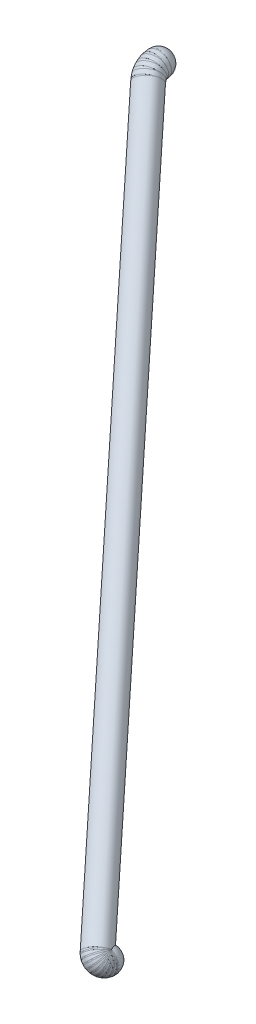
ISO-10303-21;
HEADER;
FILE_DESCRIPTION(('STEP AP214'),'2;1');
FILE_NAME('part.step','',(''),(''),'','','');
FILE_SCHEMA(('AUTOMOTIVE_DESIGN { 1 0 10303 214 1 1 1 1 }'));
ENDSEC;
DATA;
#1=APPLICATION_CONTEXT('core data for automotive mechanical design processes');
#2=APPLICATION_PROTOCOL_DEFINITION('international standard','automotive_design',2000,#1);
#3=PRODUCT_CONTEXT('',#1,'mechanical');
#4=PRODUCT('Part','Part','',(#3));
#5=PRODUCT_RELATED_PRODUCT_CATEGORY('part','',(#4));
#6=PRODUCT_DEFINITION_FORMATION('','',#4);
#7=PRODUCT_DEFINITION_CONTEXT('part definition',#1,'design');
#8=PRODUCT_DEFINITION('design','',#6,#7);
#9=PRODUCT_DEFINITION_SHAPE('','',#8);
#10=(LENGTH_UNIT() NAMED_UNIT(*) SI_UNIT(.MILLI.,.METRE.));
#11=(NAMED_UNIT(*) PLANE_ANGLE_UNIT() SI_UNIT($,.RADIAN.));
#12=(NAMED_UNIT(*) SI_UNIT($,.STERADIAN.) SOLID_ANGLE_UNIT());
#13=UNCERTAINTY_MEASURE_WITH_UNIT(LENGTH_MEASURE(1.E-05),#10,'distance_accuracy_value','');
#14=(GEOMETRIC_REPRESENTATION_CONTEXT(3) GLOBAL_UNCERTAINTY_ASSIGNED_CONTEXT((#13)) GLOBAL_UNIT_ASSIGNED_CONTEXT((#10,
#11,#12)) REPRESENTATION_CONTEXT('',''));
#15=CARTESIAN_POINT('',(0.,0.,0.));
#16=DIRECTION('',(0.,0.,1.));
#17=DIRECTION('',(1.,0.,0.));
#18=AXIS2_PLACEMENT_3D('',#15,#16,#17);
#19=CARTESIAN_POINT('',(-60.,-163.5,298.5));
#20=DIRECTION('',(0.,0.,1.));
#21=DIRECTION('',(1.,0.,0.));
#22=AXIS2_PLACEMENT_3D('',#19,#20,#21);
#23=PLANE('',#22);
#24=CARTESIAN_POINT('',(-60.,-163.5,298.5));
#25=DIRECTION('',(0.,0.,1.));
#26=DIRECTION('',(1.,0.,0.));
#27=AXIS2_PLACEMENT_3D('',#24,#25,#26);
#28=CIRCLE('',#27,1.9);
#29=CARTESIAN_POINT('',(-58.1,-163.5,298.5));
#30=VERTEX_POINT('',#29);
#31=EDGE_CURVE('P0_E11',#30,#30,#28,.T.);
#32=ORIENTED_EDGE('',*,*,#31,.F.);
#33=EDGE_LOOP('',(#32));
#34=FACE_BOUND('',#33,.T.);
#35=ADVANCED_FACE('P0_F16',(#34),#23,.F.);
#36=CARTESIAN_POINT('',(-60.,-163.5,298.53));
#37=DIRECTION('',(0.,0.,1.));
#38=DIRECTION('',(1.,0.,0.));
#39=AXIS2_PLACEMENT_3D('',#36,#37,#38);
#40=PLANE('',#39);
#41=CARTESIAN_POINT('',(-60.,-163.5,298.53));
#42=DIRECTION('',(0.,0.,1.));
#43=DIRECTION('',(1.,0.,0.));
#44=AXIS2_PLACEMENT_3D('',#41,#42,#43);
#45=CIRCLE('',#44,1.9);
#46=CARTESIAN_POINT('',(-58.1,-163.5,298.53));
#47=VERTEX_POINT('',#46);
#48=EDGE_CURVE('P0_E41',#47,#47,#45,.T.);
#49=ORIENTED_EDGE('',*,*,#48,.T.);
#50=EDGE_LOOP('',(#49));
#51=FACE_BOUND('',#50,.T.);
#52=ADVANCED_FACE('P0_F18',(#51),#40,.T.);
#53=CARTESIAN_POINT('',(-60.,-163.5,298.5));
#54=DIRECTION('',(0.,0.,1.));
#55=DIRECTION('',(1.,0.,0.));
#56=AXIS2_PLACEMENT_3D('',#53,#54,#55);
#57=CYLINDRICAL_SURFACE('',#56,1.9);
#58=ORIENTED_EDGE('',*,*,#48,.F.);
#59=DIRECTION('',(0.,0.,1.));
#60=VECTOR('',#59,1.);
#61=CARTESIAN_POINT('',(-58.1,-163.5,298.5));
#62=LINE('',#61,#60);
#63=EDGE_CURVE('P0_E26',#30,#47,#62,.T.);
#64=ORIENTED_EDGE('',*,*,#63,.F.);
#65=ORIENTED_EDGE('',*,*,#31,.T.);
#66=ORIENTED_EDGE('',*,*,#63,.T.);
#67=EDGE_LOOP('',(#58,#64,#65,#66));
#68=FACE_BOUND('',#67,.T.);
#69=ADVANCED_FACE('P0_F40',(#68),#57,.T.);
#70=CLOSED_SHELL('',(#35,#52,#69));
#71=MANIFOLD_SOLID_BREP('P0_B1',#70);
#72=CARTESIAN_POINT('',(-60.,-163.5,298.53));
#73=DIRECTION('',(-0.0867359547423549,0.0890184798671858,0.992246231737399));
#74=DIRECTION('',(0.71622958814504,0.6978647269103,0.));
#75=AXIS2_PLACEMENT_3D('',#72,#73,#74);
#76=PLANE('',#75);
#77=CARTESIAN_POINT('',(-60.,-163.5,298.53));
#78=DIRECTION('',(-0.0867359547423549,0.0890184798671977,0.992246231737398));
#79=DIRECTION('',(0.,0.995999820742464,-0.0893552297349117));
#80=AXIS2_PLACEMENT_3D('',#77,#78,#79);
#81=CIRCLE('',#80,1.9);
#82=CARTESIAN_POINT('',(-60.,-161.6076003405,298.3602250635));
#83=VERTEX_POINT('',#82);
#84=EDGE_CURVE('P1_E11',#83,#83,#81,.T.);
#85=ORIENTED_EDGE('',*,*,#84,.F.);
#86=EDGE_LOOP('',(#85));
#87=FACE_BOUND('',#86,.T.);
#88=ADVANCED_FACE('P1_F16',(#87),#76,.F.);
#89=CARTESIAN_POINT('',(-60.01528279548,-163.4843150256,298.70483287377));
#90=DIRECTION('',(-0.0867359547423549,0.0890184798671858,0.992246231737399));
#91=DIRECTION('',(0.71622958814504,0.6978647269103,0.));
#92=AXIS2_PLACEMENT_3D('',#89,#90,#91);
#93=PLANE('',#92);
#94=CARTESIAN_POINT('',(-60.01528279548,-163.4843150256,298.70483287377));
#95=DIRECTION('',(-0.0867359547423549,0.0890184798671977,0.992246231737398));
#96=DIRECTION('',(0.,0.995999820742464,-0.0893552297349117));
#97=AXIS2_PLACEMENT_3D('',#94,#95,#96);
#98=CIRCLE('',#97,1.9);
#99=CARTESIAN_POINT('',(-60.01528279548,-161.5919153662,298.53505793728));
#100=VERTEX_POINT('',#99);
#101=EDGE_CURVE('P1_E41',#100,#100,#98,.T.);
#102=ORIENTED_EDGE('',*,*,#101,.T.);
#103=EDGE_LOOP('',(#102));
#104=FACE_BOUND('',#103,.T.);
#105=ADVANCED_FACE('P1_F18',(#104),#93,.T.);
#106=CARTESIAN_POINT('',(-60.,-163.5,298.53));
#107=DIRECTION('',(-0.0867359547423549,0.0890184798671977,0.992246231737398));
#108=DIRECTION('',(0.,0.995999820742464,-0.0893552297349117));
#109=AXIS2_PLACEMENT_3D('',#106,#107,#108);
#110=CYLINDRICAL_SURFACE('',#109,1.9);
#111=ORIENTED_EDGE('',*,*,#101,.F.);
#112=DIRECTION('',(-0.0867359547423549,0.0890184798671858,0.992246231737399));
#113=VECTOR('',#112,1.);
#114=CARTESIAN_POINT('',(-60.,-161.6076003405,298.3602250635));
#115=LINE('',#114,#113);
#116=EDGE_CURVE('P1_E20',#83,#100,#115,.T.);
#117=ORIENTED_EDGE('',*,*,#116,.F.);
#118=ORIENTED_EDGE('',*,*,#84,.T.);
#119=ORIENTED_EDGE('',*,*,#116,.T.);
#120=EDGE_LOOP('',(#111,#117,#118,#119));
#121=FACE_BOUND('',#120,.T.);
#122=ADVANCED_FACE('P1_F40',(#121),#110,.T.);
#123=CLOSED_SHELL('',(#88,#105,#122));
#124=MANIFOLD_SOLID_BREP('P1_B1',#123);
#125=CARTESIAN_POINT('',(-60.01528279548,-163.4843150256,298.70483287377));
#126=DIRECTION('',(-0.254848478864056,0.261555017782057,0.930935672049205));
#127=DIRECTION('',(0.716229588145616,0.697864726909709,0.));
#128=AXIS2_PLACEMENT_3D('',#125,#126,#127);
#129=PLANE('',#128);
#130=CARTESIAN_POINT('',(-60.01528279548,-163.4843150256,298.70483287377));
#131=DIRECTION('',(-0.254848478864056,0.2615550177822,0.930935672049165));
#132=DIRECTION('',(0.,0.962723851674372,-0.270486201898104));
#133=AXIS2_PLACEMENT_3D('',#130,#131,#132);
#134=CIRCLE('',#133,1.9);
#135=CARTESIAN_POINT('',(-60.01528279548,-161.6551397075,298.19090909017));
#136=VERTEX_POINT('',#135);
#137=EDGE_CURVE('P2_E11',#136,#136,#134,.T.);
#138=ORIENTED_EDGE('',*,*,#137,.F.);
#139=EDGE_LOOP('',(#138));
#140=FACE_BOUND('',#139,.T.);
#141=ADVANCED_FACE('P2_F16',(#140),#129,.F.);
#142=CARTESIAN_POINT('',(-60.06018686315,-163.438229272,298.8688628833));
#143=DIRECTION('',(-0.254848478864056,0.261555017782057,0.930935672049205));
#144=DIRECTION('',(0.716229588145616,0.697864726909709,0.));
#145=AXIS2_PLACEMENT_3D('',#142,#143,#144);
#146=PLANE('',#145);
#147=CARTESIAN_POINT('',(-60.06018686315,-163.438229272,298.8688628833));
#148=DIRECTION('',(-0.254848478864056,0.2615550177822,0.930935672049165));
#149=DIRECTION('',(0.,0.962723851674372,-0.270486201898104));
#150=AXIS2_PLACEMENT_3D('',#147,#148,#149);
#151=CIRCLE('',#150,1.9);
#152=CARTESIAN_POINT('',(-60.06018686315,-161.6090539538,298.3549390997));
#153=VERTEX_POINT('',#152);
#154=EDGE_CURVE('P2_E40',#153,#153,#151,.T.);
#155=ORIENTED_EDGE('',*,*,#154,.T.);
#156=EDGE_LOOP('',(#155));
#157=FACE_BOUND('',#156,.T.);
#158=ADVANCED_FACE('P2_F43',(#157),#146,.T.);
#159=CARTESIAN_POINT('',(-60.01528279548,-163.4843150256,298.70483287377));
#160=DIRECTION('',(-0.254848478864056,0.2615550177822,0.930935672049165));
#161=DIRECTION('',(0.,0.962723851674372,-0.270486201898104));
#162=AXIS2_PLACEMENT_3D('',#159,#160,#161);
#163=CYLINDRICAL_SURFACE('',#162,1.9);
#164=ORIENTED_EDGE('',*,*,#154,.F.);
#165=DIRECTION('',(-0.254848478864056,0.261555017782057,0.930935672049205));
#166=VECTOR('',#165,1.);
#167=CARTESIAN_POINT('',(-60.01528279548,-161.6551397075,298.19090909017));
#168=LINE('',#167,#166);
#169=EDGE_CURVE('P2_E20',#136,#153,#168,.T.);
#170=ORIENTED_EDGE('',*,*,#169,.F.);
#171=ORIENTED_EDGE('',*,*,#137,.T.);
#172=ORIENTED_EDGE('',*,*,#169,.T.);
#173=EDGE_LOOP('',(#164,#170,#171,#172));
#174=FACE_BOUND('',#173,.T.);
#175=ADVANCED_FACE('P2_F18',(#174),#163,.T.);
#176=CLOSED_SHELL('',(#141,#158,#175));
#177=MANIFOLD_SOLID_BREP('P2_B1',#176);
#178=CARTESIAN_POINT('',(-60.06018686315,-163.438229272,298.8688628833));
#179=DIRECTION('',(-0.407214001511057,0.417930159446059,0.812102911458114));
#180=DIRECTION('',(0.716229588145331,0.697864726910001,0.));
#181=AXIS2_PLACEMENT_3D('',#178,#179,#180);
#182=PLANE('',#181);
#183=CARTESIAN_POINT('',(-60.06018686315,-163.438229272,298.8688628833));
#184=DIRECTION('',(-0.407214001511057,0.417930159446104,0.81210291145809));
#185=DIRECTION('',(0.,0.889164315716029,-0.457588045798015));
#186=AXIS2_PLACEMENT_3D('',#183,#184,#185);
#187=CIRCLE('',#186,1.9);
#188=CARTESIAN_POINT('',(-60.06018686315,-161.7488170721,297.99944559629));
#189=VERTEX_POINT('',#188);
#190=EDGE_CURVE('P3_E11',#189,#189,#187,.T.);
#191=ORIENTED_EDGE('',*,*,#190,.F.);
#192=EDGE_LOOP('',(#191));
#193=FACE_BOUND('',#192,.T.);
#194=ADVANCED_FACE('P3_F16',(#193),#182,.F.);
#195=CARTESIAN_POINT('',(-60.13193759583,-163.3645903621,299.01195466967));
#196=DIRECTION('',(-0.407214001511057,0.417930159446059,0.812102911458114));
#197=DIRECTION('',(0.716229588145331,0.697864726910001,0.));
#198=AXIS2_PLACEMENT_3D('',#195,#196,#197);
#199=PLANE('',#198);
#200=CARTESIAN_POINT('',(-60.13193759583,-163.3645903621,299.01195466967));
#201=DIRECTION('',(-0.407214001511057,0.417930159446104,0.81210291145809));
#202=DIRECTION('',(0.,0.889164315716029,-0.457588045798015));
#203=AXIS2_PLACEMENT_3D('',#200,#201,#202);
#204=CIRCLE('',#203,1.9);
#205=CARTESIAN_POINT('',(-60.13193759583,-161.6751781623,298.14253738265));
#206=VERTEX_POINT('',#205);
#207=EDGE_CURVE('P3_E40',#206,#206,#204,.T.);
#208=ORIENTED_EDGE('',*,*,#207,.T.);
#209=EDGE_LOOP('',(#208));
#210=FACE_BOUND('',#209,.T.);
#211=ADVANCED_FACE('P3_F44',(#210),#199,.T.);
#212=CARTESIAN_POINT('',(-60.06018686315,-163.438229272,298.8688628833));
#213=DIRECTION('',(-0.407214001511057,0.417930159446104,0.81210291145809));
#214=DIRECTION('',(0.,0.889164315716029,-0.457588045798015));
#215=AXIS2_PLACEMENT_3D('',#212,#213,#214);
#216=CYLINDRICAL_SURFACE('',#215,1.9);
#217=ORIENTED_EDGE('',*,*,#207,.F.);
#218=DIRECTION('',(-0.407214001511057,0.417930159446059,0.812102911458114));
#219=VECTOR('',#218,1.);
#220=CARTESIAN_POINT('',(-60.06018686315,-161.7488170721,297.99944559629));
#221=LINE('',#220,#219);
#222=EDGE_CURVE('P3_E24',#189,#206,#221,.T.);
#223=ORIENTED_EDGE('',*,*,#222,.F.);
#224=ORIENTED_EDGE('',*,*,#190,.T.);
#225=ORIENTED_EDGE('',*,*,#222,.T.);
#226=EDGE_LOOP('',(#217,#223,#224,#225));
#227=FACE_BOUND('',#226,.T.);
#228=ADVANCED_FACE('P3_F39',(#227),#216,.T.);
#229=CLOSED_SHELL('',(#194,#211,#228));
#230=MANIFOLD_SOLID_BREP('P3_B1',#229);
#231=CARTESIAN_POINT('',(-60.13193759583,-163.3645903621,299.01195466967));
#232=DIRECTION('',(-0.534417908476082,0.548481537646084,0.643090586124099));
#233=DIRECTION('',(0.716229588144646,0.697864726910704,0.));
#234=AXIS2_PLACEMENT_3D('',#231,#232,#233);
#235=PLANE('',#234);
#236=CARTESIAN_POINT('',(-60.13193759583,-163.3645903621,299.01195466967));
#237=DIRECTION('',(-0.534417908476082,0.548481537645893,0.643090586124262));
#238=DIRECTION('',(0.,0.760855508919188,-0.648921331555161));
#239=AXIS2_PLACEMENT_3D('',#236,#237,#238);
#240=CIRCLE('',#239,1.9);
#241=CARTESIAN_POINT('',(-60.13193759583,-161.9189648952,297.77900413971));
#242=VERTEX_POINT('',#241);
#243=EDGE_CURVE('P4_E11',#242,#242,#240,.T.);
#244=ORIENTED_EDGE('',*,*,#243,.F.);
#245=EDGE_LOOP('',(#244));
#246=FACE_BOUND('',#245,.T.);
#247=ADVANCED_FACE('P4_F16',(#246),#235,.F.);
#248=CARTESIAN_POINT('',(-60.22610153997,-163.2679484195,299.12526663969));
#249=DIRECTION('',(-0.534417908476082,0.548481537646084,0.643090586124099));
#250=DIRECTION('',(0.716229588144646,0.697864726910704,0.));
#251=AXIS2_PLACEMENT_3D('',#248,#249,#250);
#252=PLANE('',#251);
#253=CARTESIAN_POINT('',(-60.22610153997,-163.2679484195,299.12526663969));
#254=DIRECTION('',(-0.534417908476082,0.548481537645893,0.643090586124262));
#255=DIRECTION('',(0.,0.760855508919188,-0.648921331555161));
#256=AXIS2_PLACEMENT_3D('',#253,#254,#255);
#257=CIRCLE('',#256,1.9);
#258=CARTESIAN_POINT('',(-60.22610153997,-161.8223229525,297.89231610974));
#259=VERTEX_POINT('',#258);
#260=EDGE_CURVE('P4_E40',#259,#259,#257,.T.);
#261=ORIENTED_EDGE('',*,*,#260,.T.);
#262=EDGE_LOOP('',(#261));
#263=FACE_BOUND('',#262,.T.);
#264=ADVANCED_FACE('P4_F43',(#263),#252,.T.);
#265=CARTESIAN_POINT('',(-60.13193759583,-163.3645903621,299.01195466967));
#266=DIRECTION('',(-0.534417908476082,0.548481537645893,0.643090586124262));
#267=DIRECTION('',(0.,0.760855508919188,-0.648921331555161));
#268=AXIS2_PLACEMENT_3D('',#265,#266,#267);
#269=CYLINDRICAL_SURFACE('',#268,1.9);
#270=ORIENTED_EDGE('',*,*,#260,.F.);
#271=DIRECTION('',(-0.534417908476082,0.548481537646084,0.643090586124099));
#272=VECTOR('',#271,1.);
#273=CARTESIAN_POINT('',(-60.13193759583,-161.9189648952,297.77900413971));
#274=LINE('',#273,#272);
#275=EDGE_CURVE('P4_E19',#242,#259,#274,.T.);
#276=ORIENTED_EDGE('',*,*,#275,.F.);
#277=ORIENTED_EDGE('',*,*,#243,.T.);
#278=ORIENTED_EDGE('',*,*,#275,.T.);
#279=EDGE_LOOP('',(#270,#276,#277,#278));
#280=FACE_BOUND('',#279,.T.);
#281=ADVANCED_FACE('P4_F39',(#280),#269,.T.);
#282=CLOSED_SHELL('',(#247,#264,#281));
#283=MANIFOLD_SOLID_BREP('P4_B1',#282);
#284=CARTESIAN_POINT('',(-60.22610153997,-163.2679484195,299.12526663969));
#285=DIRECTION('',(-0.628600313288895,0.645142426795892,0.434341910573928));
#286=DIRECTION('',(0.568463974274732,0.,0.822708156001736));
#287=AXIS2_PLACEMENT_3D('',#284,#285,#286);
#288=PLANE('',#287);
#289=CARTESIAN_POINT('',(-60.22610153997,-163.2679484195,299.12526663969));
#290=DIRECTION('',(-0.628600313288356,0.645142426796418,0.434341910573928));
#291=DIRECTION('',(0.71622958814517,0.697864726910166,0.));
#292=AXIS2_PLACEMENT_3D('',#289,#290,#291);
#293=CIRCLE('',#292,1.9);
#294=CARTESIAN_POINT('',(-58.86526532249,-161.9420054383,299.12526663969));
#295=VERTEX_POINT('',#294);
#296=EDGE_CURVE('P5_E11',#295,#295,#293,.T.);
#297=ORIENTED_EDGE('',*,*,#296,.F.);
#298=EDGE_LOOP('',(#297));
#299=FACE_BOUND('',#298,.T.);
#300=ADVANCED_FACE('P5_F16',(#299),#288,.F.);
#301=CARTESIAN_POINT('',(-60.33686033725,-163.154274917,299.20179728501));
#302=DIRECTION('',(-0.628600313288895,0.645142426795892,0.434341910573928));
#303=DIRECTION('',(0.568463974274732,0.,0.822708156001736));
#304=AXIS2_PLACEMENT_3D('',#301,#302,#303);
#305=PLANE('',#304);
#306=CARTESIAN_POINT('',(-60.33686033725,-163.154274917,299.20179728501));
#307=DIRECTION('',(-0.628600313288356,0.645142426796418,0.434341910573928));
#308=DIRECTION('',(0.71622958814517,0.697864726910166,0.));
#309=AXIS2_PLACEMENT_3D('',#306,#307,#308);
#310=CIRCLE('',#309,1.9);
#311=CARTESIAN_POINT('',(-58.97602411977,-161.8283319359,299.20179728501));
#312=VERTEX_POINT('',#311);
#313=EDGE_CURVE('P5_E40',#312,#312,#310,.T.);
#314=ORIENTED_EDGE('',*,*,#313,.T.);
#315=EDGE_LOOP('',(#314));
#316=FACE_BOUND('',#315,.T.);
#317=ADVANCED_FACE('P5_F44',(#316),#305,.T.);
#318=CARTESIAN_POINT('',(-60.22610153997,-163.2679484195,299.12526663969));
#319=DIRECTION('',(-0.628600313288356,0.645142426796418,0.434341910573928));
#320=DIRECTION('',(0.71622958814517,0.697864726910166,0.));
#321=AXIS2_PLACEMENT_3D('',#318,#319,#320);
#322=CYLINDRICAL_SURFACE('',#321,1.9);
#323=ORIENTED_EDGE('',*,*,#313,.F.);
#324=DIRECTION('',(-0.628600313288895,0.645142426795892,0.434341910573928));
#325=VECTOR('',#324,1.);
#326=CARTESIAN_POINT('',(-58.86526532249,-161.9420054383,299.12526663969));
#327=LINE('',#326,#325);
#328=EDGE_CURVE('P5_E24',#295,#312,#327,.T.);
#329=ORIENTED_EDGE('',*,*,#328,.F.);
#330=ORIENTED_EDGE('',*,*,#296,.T.);
#331=ORIENTED_EDGE('',*,*,#328,.T.);
#332=EDGE_LOOP('',(#323,#329,#330,#331));
#333=FACE_BOUND('',#332,.T.);
#334=ADVANCED_FACE('P5_F39',(#333),#322,.T.);
#335=CLOSED_SHELL('',(#300,#317,#334));
#336=MANIFOLD_SOLID_BREP('P5_B1',#335);
#337=CARTESIAN_POINT('',(-60.33686033725,-163.154274917,299.20179728501));
#338=DIRECTION('',(-0.683941716951242,0.701940183187249,0.19875539499807));
#339=DIRECTION('',(0.27905837744282,0.,0.960274138972294));
#340=AXIS2_PLACEMENT_3D('',#337,#338,#339);
#341=PLANE('',#340);
#342=CARTESIAN_POINT('',(-60.33686033725,-163.154274917,299.20179728501));
#343=DIRECTION('',(-0.683941716951208,0.701940183187282,0.19875539499807));
#344=DIRECTION('',(0.71622958814517,0.697864726910166,0.));
#345=AXIS2_PLACEMENT_3D('',#342,#343,#344);
#346=CIRCLE('',#345,1.9);
#347=CARTESIAN_POINT('',(-58.97602411977,-161.8283319359,299.20179728501));
#348=VERTEX_POINT('',#347);
#349=EDGE_CURVE('P6_E11',#348,#348,#346,.T.);
#350=ORIENTED_EDGE('',*,*,#349,.F.);
#351=EDGE_LOOP('',(#350));
#352=FACE_BOUND('',#351,.T.);
#353=ADVANCED_FACE('P6_F16',(#352),#341,.F.);
#354=CARTESIAN_POINT('',(-60.45737023897,-163.0305937021,299.23681780288));
#355=DIRECTION('',(-0.683941716951242,0.701940183187249,0.19875539499807));
#356=DIRECTION('',(0.27905837744282,0.,0.960274138972294));
#357=AXIS2_PLACEMENT_3D('',#354,#355,#356);
#358=PLANE('',#357);
#359=CARTESIAN_POINT('',(-60.45737023897,-163.0305937021,299.23681780288));
#360=DIRECTION('',(-0.683941716951208,0.701940183187282,0.19875539499807));
#361=DIRECTION('',(0.71622958814517,0.697864726910166,0.));
#362=AXIS2_PLACEMENT_3D('',#359,#360,#361);
#363=CIRCLE('',#362,1.9);
#364=CARTESIAN_POINT('',(-59.09653402149,-161.7046507209,299.23681780288));
#365=VERTEX_POINT('',#364);
#366=EDGE_CURVE('P6_E40',#365,#365,#363,.T.);
#367=ORIENTED_EDGE('',*,*,#366,.T.);
#368=EDGE_LOOP('',(#367));
#369=FACE_BOUND('',#368,.T.);
#370=ADVANCED_FACE('P6_F43',(#369),#358,.T.);
#371=CARTESIAN_POINT('',(-60.33686033725,-163.154274917,299.20179728501));
#372=DIRECTION('',(-0.683941716951208,0.701940183187282,0.19875539499807));
#373=DIRECTION('',(0.71622958814517,0.697864726910166,0.));
#374=AXIS2_PLACEMENT_3D('',#371,#372,#373);
#375=CYLINDRICAL_SURFACE('',#374,1.9);
#376=ORIENTED_EDGE('',*,*,#366,.F.);
#377=DIRECTION('',(-0.683941716951242,0.701940183187249,0.19875539499807));
#378=VECTOR('',#377,1.);
#379=CARTESIAN_POINT('',(-58.97602411977,-161.8283319359,299.20179728501));
#380=LINE('',#379,#378);
#381=EDGE_CURVE('P6_E20',#348,#365,#380,.T.);
#382=ORIENTED_EDGE('',*,*,#381,.F.);
#383=ORIENTED_EDGE('',*,*,#349,.T.);
#384=ORIENTED_EDGE('',*,*,#381,.T.);
#385=EDGE_LOOP('',(#376,#382,#383,#384));
#386=FACE_BOUND('',#385,.T.);
#387=ADVANCED_FACE('P6_F18',(#386),#375,.T.);
#388=CLOSED_SHELL('',(#353,#370,#387));
#389=MANIFOLD_SOLID_BREP('P6_B1',#388);
#390=CARTESIAN_POINT('',(-60.45737023897,-163.0305937021,299.23681780288));
#391=DIRECTION('',(-0.697022592814664,0.715365292625655,-0.0491121493373463));
#392=DIRECTION('',(-0.0702856562176884,0.,0.997526905165995));
#393=AXIS2_PLACEMENT_3D('',#390,#391,#392);
#394=PLANE('',#393);
#395=CARTESIAN_POINT('',(-60.45737023897,-163.0305937021,299.23681780288));
#396=DIRECTION('',(-0.697022592814441,0.715365292625873,-0.0491121493373463));
#397=DIRECTION('',(0.71622958814517,0.697864726910166,0.));
#398=AXIS2_PLACEMENT_3D('',#395,#396,#397);
#399=CIRCLE('',#398,1.9);
#400=CARTESIAN_POINT('',(-59.09653402149,-161.7046507209,299.23681780288));
#401=VERTEX_POINT('',#400);
#402=EDGE_CURVE('P7_E11',#401,#401,#399,.T.);
#403=ORIENTED_EDGE('',*,*,#402,.F.);
#404=EDGE_LOOP('',(#403));
#405=FACE_BOUND('',#404,.T.);
#406=ADVANCED_FACE('P7_F16',(#405),#394,.F.);
#407=CARTESIAN_POINT('',(-60.58018497899,-162.9045469952,299.22816428732));
#408=DIRECTION('',(-0.697022592814664,0.715365292625655,-0.0491121493373463));
#409=DIRECTION('',(-0.0702856562176884,0.,0.997526905165995));
#410=AXIS2_PLACEMENT_3D('',#407,#408,#409);
#411=PLANE('',#410);
#412=CARTESIAN_POINT('',(-60.58018497899,-162.9045469952,299.22816428732));
#413=DIRECTION('',(-0.697022592814441,0.715365292625873,-0.0491121493373463));
#414=DIRECTION('',(0.71622958814517,0.697864726910166,0.));
#415=AXIS2_PLACEMENT_3D('',#412,#413,#414);
#416=CIRCLE('',#415,1.9);
#417=CARTESIAN_POINT('',(-59.21934876152,-161.5786040141,299.22816428732));
#418=VERTEX_POINT('',#417);
#419=EDGE_CURVE('P7_E20',#418,#418,#416,.T.);
#420=ORIENTED_EDGE('',*,*,#419,.T.);
#421=EDGE_LOOP('',(#420));
#422=FACE_BOUND('',#421,.T.);
#423=ADVANCED_FACE('P7_F44',(#422),#411,.T.);
#424=CARTESIAN_POINT('',(-60.45737023897,-163.0305937021,299.23681780288));
#425=DIRECTION('',(-0.697022592814441,0.715365292625873,-0.0491121493373463));
#426=DIRECTION('',(0.71622958814517,0.697864726910166,0.));
#427=AXIS2_PLACEMENT_3D('',#424,#425,#426);
#428=CYLINDRICAL_SURFACE('',#427,1.9);
#429=ORIENTED_EDGE('',*,*,#419,.F.);
#430=DIRECTION('',(-0.697022592814664,0.715365292625655,-0.0491121493373463));
#431=VECTOR('',#430,1.);
#432=CARTESIAN_POINT('',(-59.09653402149,-161.7046507209,299.23681780288));
#433=LINE('',#432,#431);
#434=EDGE_CURVE('P7_E26',#401,#418,#433,.T.);
#435=ORIENTED_EDGE('',*,*,#434,.F.);
#436=ORIENTED_EDGE('',*,*,#402,.T.);
#437=ORIENTED_EDGE('',*,*,#434,.T.);
#438=EDGE_LOOP('',(#429,#435,#436,#437));
#439=FACE_BOUND('',#438,.T.);
#440=ADVANCED_FACE('P7_F18',(#439),#428,.T.);
#441=CLOSED_SHELL('',(#406,#423,#440));
#442=MANIFOLD_SOLID_BREP('P7_B1',#441);
#443=CARTESIAN_POINT('',(-60.58018497899,-162.9045469952,299.22816428732));
#444=DIRECTION('',(-0.667034677974744,0.684588222131737,-0.293945070544887));
#445=DIRECTION('',(-0.403255545355083,0.,0.915087408470019));
#446=AXIS2_PLACEMENT_3D('',#443,#444,#445);
#447=PLANE('',#446);
#448=CARTESIAN_POINT('',(-60.58018497899,-162.9045469952,299.22816428732));
#449=DIRECTION('',(-0.667034677974373,0.684588222132097,-0.293945070544887));
#450=DIRECTION('',(0.71622958814517,0.697864726910166,0.));
#451=AXIS2_PLACEMENT_3D('',#448,#449,#450);
#452=CIRCLE('',#451,1.9);
#453=CARTESIAN_POINT('',(-59.21934876152,-161.5786040141,299.22816428732));
#454=VERTEX_POINT('',#453);
#455=EDGE_CURVE('P8_E11',#454,#454,#452,.T.);
#456=ORIENTED_EDGE('',*,*,#455,.F.);
#457=EDGE_LOOP('',(#456));
#458=FACE_BOUND('',#457,.T.);
#459=ADVANCED_FACE('P8_F16',(#458),#447,.F.);
#460=CARTESIAN_POINT('',(-60.69771587599,-162.7839231799,299.17637143614));
#461=DIRECTION('',(-0.667034677974744,0.684588222131737,-0.293945070544887));
#462=DIRECTION('',(-0.403255545355083,0.,0.915087408470019));
#463=AXIS2_PLACEMENT_3D('',#460,#461,#462);
#464=PLANE('',#463);
#465=CARTESIAN_POINT('',(-60.69771587599,-162.7839231799,299.17637143614));
#466=DIRECTION('',(-0.667034677974373,0.684588222132097,-0.293945070544887));
#467=DIRECTION('',(0.71622958814517,0.697864726910166,0.));
#468=AXIS2_PLACEMENT_3D('',#465,#466,#467);
#469=CIRCLE('',#468,1.9);
#470=CARTESIAN_POINT('',(-59.33687965851,-161.4579801987,299.17637143614));
#471=VERTEX_POINT('',#470);
#472=EDGE_CURVE('P8_E19',#471,#471,#469,.T.);
#473=ORIENTED_EDGE('',*,*,#472,.T.);
#474=EDGE_LOOP('',(#473));
#475=FACE_BOUND('',#474,.T.);
#476=ADVANCED_FACE('P8_F44',(#475),#464,.T.);
#477=CARTESIAN_POINT('',(-60.58018497899,-162.9045469952,299.22816428732));
#478=DIRECTION('',(-0.667034677974373,0.684588222132097,-0.293945070544887));
#479=DIRECTION('',(0.71622958814517,0.697864726910166,0.));
#480=AXIS2_PLACEMENT_3D('',#477,#478,#479);
#481=CYLINDRICAL_SURFACE('',#480,1.9);
#482=ORIENTED_EDGE('',*,*,#472,.F.);
#483=DIRECTION('',(-0.667034677974743,0.684588222131737,-0.293945070544887));
#484=VECTOR('',#483,1.);
#485=CARTESIAN_POINT('',(-59.21934876152,-161.5786040141,299.22816428732));
#486=LINE('',#485,#484);
#487=EDGE_CURVE('P8_E25',#454,#471,#486,.T.);
#488=ORIENTED_EDGE('',*,*,#487,.F.);
#489=ORIENTED_EDGE('',*,*,#455,.T.);
#490=ORIENTED_EDGE('',*,*,#487,.T.);
#491=EDGE_LOOP('',(#482,#488,#489,#490));
#492=FACE_BOUND('',#491,.T.);
#493=ADVANCED_FACE('P8_F41',(#492),#481,.T.);
#494=CLOSED_SHELL('',(#459,#476,#493));
#495=MANIFOLD_SOLID_BREP('P8_B1',#494);
#496=CARTESIAN_POINT('',(-60.69771587599,-162.7839231799,299.17637143614));
#497=DIRECTION('',(-0.595830915565677,0.611510676501668,-0.520615225075717));
#498=DIRECTION('',(-0.65797702157981,0.,0.753038006393411));
#499=AXIS2_PLACEMENT_3D('',#496,#497,#498);
#500=PLANE('',#499);
#501=CARTESIAN_POINT('',(-60.69771587599,-162.7839231799,299.17637143614));
#502=DIRECTION('',(-0.595830915565478,0.611510676501861,-0.520615225075717));
#503=DIRECTION('',(0.71622958814517,0.697864726910166,0.));
#504=AXIS2_PLACEMENT_3D('',#501,#502,#503);
#505=CIRCLE('',#504,1.9);
#506=CARTESIAN_POINT('',(-59.33687965851,-161.4579801987,299.17637143614));
#507=VERTEX_POINT('',#506);
#508=EDGE_CURVE('P9_E11',#507,#507,#505,.T.);
#509=ORIENTED_EDGE('',*,*,#508,.F.);
#510=EDGE_LOOP('',(#509));
#511=FACE_BOUND('',#510,.T.);
#512=ADVANCED_FACE('P9_F16',(#511),#500,.F.);
#513=CARTESIAN_POINT('',(-60.80270073552,-162.6761755609,299.08463951212));
#514=DIRECTION('',(-0.595830915565677,0.611510676501668,-0.520615225075717));
#515=DIRECTION('',(-0.65797702157981,0.,0.753038006393411));
#516=AXIS2_PLACEMENT_3D('',#513,#514,#515);
#517=PLANE('',#516);
#518=CARTESIAN_POINT('',(-60.80270073552,-162.6761755609,299.08463951212));
#519=DIRECTION('',(-0.595830915565478,0.611510676501861,-0.520615225075717));
#520=DIRECTION('',(0.71622958814517,0.697864726910166,0.));
#521=AXIS2_PLACEMENT_3D('',#518,#519,#520);
#522=CIRCLE('',#521,1.9);
#523=CARTESIAN_POINT('',(-59.44186451804,-161.3502325797,299.08463951212));
#524=VERTEX_POINT('',#523);
#525=EDGE_CURVE('P9_E42',#524,#524,#522,.T.);
#526=ORIENTED_EDGE('',*,*,#525,.T.);
#527=EDGE_LOOP('',(#526));
#528=FACE_BOUND('',#527,.T.);
#529=ADVANCED_FACE('P9_F18',(#528),#517,.T.);
#530=CARTESIAN_POINT('',(-60.69771587599,-162.7839231799,299.17637143614));
#531=DIRECTION('',(-0.595830915565478,0.611510676501861,-0.520615225075717));
#532=DIRECTION('',(0.71622958814517,0.697864726910166,0.));
#533=AXIS2_PLACEMENT_3D('',#530,#531,#532);
#534=CYLINDRICAL_SURFACE('',#533,1.9);
#535=ORIENTED_EDGE('',*,*,#525,.F.);
#536=DIRECTION('',(-0.595830915565677,0.611510676501668,-0.520615225075717));
#537=VECTOR('',#536,1.);
#538=CARTESIAN_POINT('',(-59.33687965851,-161.4579801987,299.17637143614));
#539=LINE('',#538,#537);
#540=EDGE_CURVE('P9_E20',#507,#524,#539,.T.);
#541=ORIENTED_EDGE('',*,*,#540,.F.);
#542=ORIENTED_EDGE('',*,*,#508,.T.);
#543=ORIENTED_EDGE('',*,*,#540,.T.);
#544=EDGE_LOOP('',(#535,#541,#542,#543));
#545=FACE_BOUND('',#544,.T.);
#546=ADVANCED_FACE('P9_F41',(#545),#534,.T.);
#547=CLOSED_SHELL('',(#512,#529,#546));
#548=MANIFOLD_SOLID_BREP('P9_B1',#547);
#549=CARTESIAN_POINT('',(-60.80270073552,-162.6761755609,299.08463951212));
#550=DIRECTION('',(-0.546054922122048,0.560424788494049,-0.622694209438055));
#551=DIRECTION('',(-0.751859704857604,0.,0.659323125797538));
#552=AXIS2_PLACEMENT_3D('',#549,#550,#551);
#553=PLANE('',#552);
#554=CARTESIAN_POINT('',(-60.80270073552,-162.6761755609,299.08463951212));
#555=DIRECTION('',(-0.546054922122048,0.560424788494021,-0.62269420943808));
#556=DIRECTION('',(0.,-0.743294146247316,-0.668964731622284));
#557=AXIS2_PLACEMENT_3D('',#554,#555,#556);
#558=CIRCLE('',#557,1.9);
#559=CARTESIAN_POINT('',(-60.80270073552,-164.0884344387,297.81360652204));
#560=VERTEX_POINT('',#559);
#561=EDGE_CURVE('P10_E11',#560,#560,#558,.T.);
#562=ORIENTED_EDGE('',*,*,#561,.F.);
#563=EDGE_LOOP('',(#562));
#564=FACE_BOUND('',#563,.T.);
#565=ADVANCED_FACE('P10_F16',(#564),#553,.F.);
#566=CARTESIAN_POINT('',(-116.1972992644,-105.823824439,235.91536048787));
#567=DIRECTION('',(-0.546054922122048,0.560424788494049,-0.622694209438055));
#568=DIRECTION('',(-0.751859704857604,0.,0.659323125797538));
#569=AXIS2_PLACEMENT_3D('',#566,#567,#568);
#570=PLANE('',#569);
#571=CARTESIAN_POINT('',(-116.1972992644,-105.823824439,235.91536048787));
#572=DIRECTION('',(-0.546054922122048,0.560424788494021,-0.62269420943808));
#573=DIRECTION('',(0.,-0.743294146247316,-0.668964731622284));
#574=AXIS2_PLACEMENT_3D('',#571,#572,#573);
#575=CIRCLE('',#574,1.9);
#576=CARTESIAN_POINT('',(-116.1972992644,-107.2360833169,234.64432749779));
#577=VERTEX_POINT('',#576);
#578=EDGE_CURVE('P10_E42',#577,#577,#575,.T.);
#579=ORIENTED_EDGE('',*,*,#578,.T.);
#580=EDGE_LOOP('',(#579));
#581=FACE_BOUND('',#580,.T.);
#582=ADVANCED_FACE('P10_F18',(#581),#570,.T.);
#583=CARTESIAN_POINT('',(-60.80270073552,-162.6761755609,299.08463951212));
#584=DIRECTION('',(-0.546054922122048,0.560424788494021,-0.62269420943808));
#585=DIRECTION('',(0.,-0.743294146247316,-0.668964731622284));
#586=AXIS2_PLACEMENT_3D('',#583,#584,#585);
#587=CYLINDRICAL_SURFACE('',#586,1.9);
#588=ORIENTED_EDGE('',*,*,#578,.F.);
#589=DIRECTION('',(-0.546054922122048,0.560424788494049,-0.622694209438055));
#590=VECTOR('',#589,1.);
#591=CARTESIAN_POINT('',(-60.80270073552,-164.0884344387,297.81360652204));
#592=LINE('',#591,#590);
#593=EDGE_CURVE('P10_E20',#560,#577,#592,.T.);
#594=ORIENTED_EDGE('',*,*,#593,.F.);
#595=ORIENTED_EDGE('',*,*,#561,.T.);
#596=ORIENTED_EDGE('',*,*,#593,.T.);
#597=EDGE_LOOP('',(#588,#594,#595,#596));
#598=FACE_BOUND('',#597,.T.);
#599=ADVANCED_FACE('P10_F41',(#598),#587,.T.);
#600=CLOSED_SHELL('',(#565,#582,#599));
#601=MANIFOLD_SOLID_BREP('P10_B1',#600);
#602=CARTESIAN_POINT('',(-116.1972992644,-105.823824439,235.91536048787));
#603=DIRECTION('',(-0.493903888694812,0.506901359449807,-0.706477147910731));
#604=DIRECTION('',(-0.819575190920201,0.,0.572971645396276));
#605=AXIS2_PLACEMENT_3D('',#602,#603,#604);
#606=PLANE('',#605);
#607=CARTESIAN_POINT('',(-116.1972992644,-105.823824439,235.91536048787));
#608=DIRECTION('',(-0.493903888694812,0.506901359449916,-0.706477147910653));
#609=DIRECTION('',(0.,-0.812494237421992,-0.582969222305994));
#610=AXIS2_PLACEMENT_3D('',#607,#608,#609);
#611=CIRCLE('',#610,1.9);
#612=CARTESIAN_POINT('',(-116.1972992644,-107.3675634901,234.80771896549));
#613=VERTEX_POINT('',#612);
#614=EDGE_CURVE('P11_E11',#613,#613,#611,.T.);
#615=ORIENTED_EDGE('',*,*,#614,.F.);
#616=EDGE_LOOP('',(#615));
#617=FACE_BOUND('',#616,.T.);
#618=ADVANCED_FACE('P11_F16',(#617),#606,.F.);
#619=CARTESIAN_POINT('',(-116.5348440838,-105.4773968613,235.43253841114));
#620=DIRECTION('',(-0.493903888694812,0.506901359449807,-0.706477147910731));
#621=DIRECTION('',(-0.819575190920201,0.,0.572971645396276));
#622=AXIS2_PLACEMENT_3D('',#619,#620,#621);
#623=PLANE('',#622);
#624=CARTESIAN_POINT('',(-116.5348440838,-105.4773968613,235.43253841114));
#625=DIRECTION('',(-0.493903888694812,0.506901359449916,-0.706477147910653));
#626=DIRECTION('',(0.,-0.812494237421992,-0.582969222305994));
#627=AXIS2_PLACEMENT_3D('',#624,#625,#626);
#628=CIRCLE('',#627,1.9);
#629=CARTESIAN_POINT('',(-116.5348440838,-107.0211359124,234.32489688876));
#630=VERTEX_POINT('',#629);
#631=EDGE_CURVE('P11_E41',#630,#630,#628,.T.);
#632=ORIENTED_EDGE('',*,*,#631,.T.);
#633=EDGE_LOOP('',(#632));
#634=FACE_BOUND('',#633,.T.);
#635=ADVANCED_FACE('P11_F18',(#634),#623,.T.);
#636=CARTESIAN_POINT('',(-116.1972992644,-105.823824439,235.91536048787));
#637=DIRECTION('',(-0.493903888694812,0.506901359449916,-0.706477147910653));
#638=DIRECTION('',(0.,-0.812494237421992,-0.582969222305994));
#639=AXIS2_PLACEMENT_3D('',#636,#637,#638);
#640=CYLINDRICAL_SURFACE('',#639,1.9);
#641=ORIENTED_EDGE('',*,*,#631,.F.);
#642=DIRECTION('',(-0.493903888694812,0.506901359449807,-0.706477147910731));
#643=VECTOR('',#642,1.);
#644=CARTESIAN_POINT('',(-116.1972992644,-107.3675634901,234.80771896549));
#645=LINE('',#644,#643);
#646=EDGE_CURVE('P11_E25',#613,#630,#645,.T.);
#647=ORIENTED_EDGE('',*,*,#646,.F.);
#648=ORIENTED_EDGE('',*,*,#614,.T.);
#649=ORIENTED_EDGE('',*,*,#646,.T.);
#650=EDGE_LOOP('',(#641,#647,#648,#649));
#651=FACE_BOUND('',#650,.T.);
#652=ADVANCED_FACE('P11_F40',(#651),#640,.T.);
#653=CLOSED_SHELL('',(#618,#635,#652));
#654=MANIFOLD_SOLID_BREP('P11_B1',#653);
#655=CARTESIAN_POINT('',(-116.5348440838,-105.4773968613,235.43253841114));
#656=DIRECTION('',(-0.37166200449502,0.381442583561021,-0.846385792568045));
#657=DIRECTION('',(-0.915612969776965,0.,0.402060803332289));
#658=AXIS2_PLACEMENT_3D('',#655,#656,#657);
#659=PLANE('',#658);
#660=CARTESIAN_POINT('',(-116.5348440838,-105.4773968613,235.43253841114));
#661=DIRECTION('',(-0.37166200449502,0.381442583561517,-0.846385792567821));
#662=DIRECTION('',(0.,-0.911692011107058,-0.410874283551026));
#663=AXIS2_PLACEMENT_3D('',#660,#661,#662);
#664=CIRCLE('',#663,1.9);
#665=CARTESIAN_POINT('',(-116.5348440838,-107.2096116824,234.65187727239));
#666=VERTEX_POINT('',#665);
#667=EDGE_CURVE('P12_E11',#666,#666,#664,.T.);
#668=ORIENTED_EDGE('',*,*,#667,.F.);
#669=EDGE_LOOP('',(#668));
#670=FACE_BOUND('',#669,.T.);
#671=ADVANCED_FACE('P12_F16',(#670),#659,.F.);
#672=CARTESIAN_POINT('',(-116.7888461012,-105.2167105802,234.85409967849));
#673=DIRECTION('',(-0.37166200449502,0.381442583561021,-0.846385792568045));
#674=DIRECTION('',(-0.915612969776965,0.,0.402060803332289));
#675=AXIS2_PLACEMENT_3D('',#672,#673,#674);
#676=PLANE('',#675);
#677=CARTESIAN_POINT('',(-116.7888461012,-105.2167105802,234.85409967849));
#678=DIRECTION('',(-0.37166200449502,0.381442583561517,-0.846385792567821));
#679=DIRECTION('',(0.,-0.911692011107058,-0.410874283551026));
#680=AXIS2_PLACEMENT_3D('',#677,#678,#679);
#681=CIRCLE('',#680,1.9);
#682=CARTESIAN_POINT('',(-116.7888461012,-106.9489254013,234.07343853974));
#683=VERTEX_POINT('',#682);
#684=EDGE_CURVE('P12_E41',#683,#683,#681,.T.);
#685=ORIENTED_EDGE('',*,*,#684,.T.);
#686=EDGE_LOOP('',(#685));
#687=FACE_BOUND('',#686,.T.);
#688=ADVANCED_FACE('P12_F18',(#687),#676,.T.);
#689=CARTESIAN_POINT('',(-116.5348440838,-105.4773968613,235.43253841114));
#690=DIRECTION('',(-0.37166200449502,0.381442583561517,-0.846385792567822));
#691=DIRECTION('',(0.,-0.911692011107058,-0.410874283551026));
#692=AXIS2_PLACEMENT_3D('',#689,#690,#691);
#693=CYLINDRICAL_SURFACE('',#692,1.9);
#694=ORIENTED_EDGE('',*,*,#684,.F.);
#695=DIRECTION('',(-0.37166200449502,0.381442583561021,-0.846385792568045));
#696=VECTOR('',#695,1.);
#697=CARTESIAN_POINT('',(-116.5348440838,-107.2096116824,234.65187727239));
#698=LINE('',#697,#696);
#699=EDGE_CURVE('P12_E20',#666,#683,#698,.T.);
#700=ORIENTED_EDGE('',*,*,#699,.F.);
#701=ORIENTED_EDGE('',*,*,#667,.T.);
#702=ORIENTED_EDGE('',*,*,#699,.T.);
#703=EDGE_LOOP('',(#694,#700,#701,#702));
#704=FACE_BOUND('',#703,.T.);
#705=ADVANCED_FACE('P12_F40',(#704),#693,.T.);
#706=CLOSED_SHELL('',(#671,#688,#705));
#707=MANIFOLD_SOLID_BREP('P12_B1',#706);
#708=CARTESIAN_POINT('',(-116.7888461012,-105.2167105802,234.85409967849));
#709=DIRECTION('',(-0.230741349978936,0.236813490767934,-0.943757278117739));
#710=DIRECTION('',(-0.971388291817513,0.,0.237496918969184));
#711=AXIS2_PLACEMENT_3D('',#708,#709,#710);
#712=PLANE('',#711);
#713=CARTESIAN_POINT('',(-116.7888461012,-105.2167105802,234.85409967849));
#714=DIRECTION('',(-0.230741349978936,0.236813490767814,-0.943757278117769));
#715=DIRECTION('',(0.,-0.969930739921185,-0.243381099833046));
#716=AXIS2_PLACEMENT_3D('',#713,#714,#715);
#717=CIRCLE('',#716,1.9);
#718=CARTESIAN_POINT('',(-116.7888461012,-107.0595789861,234.39167558881));
#719=VERTEX_POINT('',#718);
#720=EDGE_CURVE('P13_E11',#719,#719,#717,.T.);
#721=ORIENTED_EDGE('',*,*,#720,.F.);
#722=EDGE_LOOP('',(#721));
#723=FACE_BOUND('',#722,.T.);
#724=ADVANCED_FACE('P13_F16',(#723),#712,.F.);
#725=CARTESIAN_POINT('',(-116.9465398329,-105.0548670135,234.20911512336));
#726=DIRECTION('',(-0.230741349978936,0.236813490767934,-0.943757278117739));
#727=DIRECTION('',(-0.971388291817513,0.,0.237496918969184));
#728=AXIS2_PLACEMENT_3D('',#725,#726,#727);
#729=PLANE('',#728);
#730=CARTESIAN_POINT('',(-116.9465398329,-105.0548670135,234.20911512336));
#731=DIRECTION('',(-0.230741349978936,0.236813490767814,-0.943757278117769));
#732=DIRECTION('',(0.,-0.969930739921185,-0.243381099833046));
#733=AXIS2_PLACEMENT_3D('',#730,#731,#732);
#734=CIRCLE('',#733,1.9);
#735=CARTESIAN_POINT('',(-116.9465398329,-106.8977354194,233.74669103368));
#736=VERTEX_POINT('',#735);
#737=EDGE_CURVE('P13_E20',#736,#736,#734,.T.);
#738=ORIENTED_EDGE('',*,*,#737,.T.);
#739=EDGE_LOOP('',(#738));
#740=FACE_BOUND('',#739,.T.);
#741=ADVANCED_FACE('P13_F44',(#740),#729,.T.);
#742=CARTESIAN_POINT('',(-116.7888461012,-105.2167105802,234.85409967849));
#743=DIRECTION('',(-0.230741349978936,0.236813490767814,-0.943757278117769));
#744=DIRECTION('',(0.,-0.969930739921185,-0.243381099833046));
#745=AXIS2_PLACEMENT_3D('',#742,#743,#744);
#746=CYLINDRICAL_SURFACE('',#745,1.9);
#747=ORIENTED_EDGE('',*,*,#737,.F.);
#748=DIRECTION('',(-0.230741349978936,0.236813490767934,-0.943757278117739));
#749=VECTOR('',#748,1.);
#750=CARTESIAN_POINT('',(-116.7888461012,-107.0595789861,234.39167558881));
#751=LINE('',#750,#749);
#752=EDGE_CURVE('P13_E26',#719,#736,#751,.T.);
#753=ORIENTED_EDGE('',*,*,#752,.F.);
#754=ORIENTED_EDGE('',*,*,#720,.T.);
#755=ORIENTED_EDGE('',*,*,#752,.T.);
#756=EDGE_LOOP('',(#747,#753,#754,#755));
#757=FACE_BOUND('',#756,.T.);
#758=ADVANCED_FACE('P13_F18',(#757),#746,.T.);
#759=CLOSED_SHELL('',(#724,#741,#758));
#760=MANIFOLD_SOLID_BREP('P13_B1',#759);
#761=CARTESIAN_POINT('',(-116.9465398329,-105.0548670135,234.20911512336));
#762=DIRECTION('',(-0.0782242324744663,0.080282764908027,-0.993697965738334));
#763=DIRECTION('',(-0.996915881347373,0.,0.0784775478553604));
#764=AXIS2_PLACEMENT_3D('',#761,#762,#763);
#765=PLANE('',#764);
#766=CARTESIAN_POINT('',(-116.9465398329,-105.0548670135,234.20911512336));
#767=DIRECTION('',(-0.0782242324744663,0.0802827649079785,-0.993697965738338));
#768=DIRECTION('',(0.,-0.996752223834713,-0.0805295242787068));
#769=AXIS2_PLACEMENT_3D('',#766,#767,#768);
#770=CIRCLE('',#769,1.9);
#771=CARTESIAN_POINT('',(-116.9465398329,-106.9486962388,234.05610902724));
#772=VERTEX_POINT('',#771);
#773=EDGE_CURVE('P14_E11',#772,#772,#770,.T.);
#774=ORIENTED_EDGE('',*,*,#773,.F.);
#775=EDGE_LOOP('',(#774));
#776=FACE_BOUND('',#775,.T.);
#777=ADVANCED_FACE('P14_F16',(#776),#765,.F.);
#778=CARTESIAN_POINT('',(-117.,-105.,233.53));
#779=DIRECTION('',(-0.0782242324744663,0.080282764908027,-0.993697965738334));
#780=DIRECTION('',(-0.996915881347373,0.,0.0784775478553604));
#781=AXIS2_PLACEMENT_3D('',#778,#779,#780);
#782=PLANE('',#781);
#783=CARTESIAN_POINT('',(-117.,-105.,233.53));
#784=DIRECTION('',(-0.0782242324744663,0.0802827649079785,-0.993697965738338));
#785=DIRECTION('',(0.,-0.996752223834713,-0.0805295242787068));
#786=AXIS2_PLACEMENT_3D('',#783,#784,#785);
#787=CIRCLE('',#786,1.9);
#788=CARTESIAN_POINT('',(-117.,-106.8938292252,233.37699390387));
#789=VERTEX_POINT('',#788);
#790=EDGE_CURVE('P14_E20',#789,#789,#787,.T.);
#791=ORIENTED_EDGE('',*,*,#790,.T.);
#792=EDGE_LOOP('',(#791));
#793=FACE_BOUND('',#792,.T.);
#794=ADVANCED_FACE('P14_F44',(#793),#782,.T.);
#795=CARTESIAN_POINT('',(-116.9465398329,-105.0548670135,234.20911512336));
#796=DIRECTION('',(-0.0782242324744663,0.0802827649079785,-0.993697965738338));
#797=DIRECTION('',(0.,-0.996752223834713,-0.0805295242787068));
#798=AXIS2_PLACEMENT_3D('',#795,#796,#797);
#799=CYLINDRICAL_SURFACE('',#798,1.9);
#800=ORIENTED_EDGE('',*,*,#790,.F.);
#801=DIRECTION('',(-0.0782242324744663,0.080282764908027,-0.993697965738334));
#802=VECTOR('',#801,1.);
#803=CARTESIAN_POINT('',(-116.9465398329,-106.9486962388,234.05610902724));
#804=LINE('',#803,#802);
#805=EDGE_CURVE('P14_E26',#772,#789,#804,.T.);
#806=ORIENTED_EDGE('',*,*,#805,.F.);
#807=ORIENTED_EDGE('',*,*,#773,.T.);
#808=ORIENTED_EDGE('',*,*,#805,.T.);
#809=EDGE_LOOP('',(#800,#806,#807,#808));
#810=FACE_BOUND('',#809,.T.);
#811=ADVANCED_FACE('P14_F18',(#810),#799,.T.);
#812=CLOSED_SHELL('',(#777,#794,#811));
#813=MANIFOLD_SOLID_BREP('P14_B1',#812);
#814=CARTESIAN_POINT('',(-117.,-105.,233.53));
#815=DIRECTION('',(0.,0.,-1.));
#816=DIRECTION('',(0.,-1.,0.));
#817=AXIS2_PLACEMENT_3D('',#814,#815,#816);
#818=PLANE('',#817);
#819=CARTESIAN_POINT('',(-117.,-105.,233.53));
#820=DIRECTION('',(0.,0.,-1.));
#821=DIRECTION('',(-1.,0.,0.));
#822=AXIS2_PLACEMENT_3D('',#819,#820,#821);
#823=CIRCLE('',#822,1.9);
#824=CARTESIAN_POINT('',(-118.9,-105.,233.53));
#825=VERTEX_POINT('',#824);
#826=EDGE_CURVE('P15_E11',#825,#825,#823,.T.);
#827=ORIENTED_EDGE('',*,*,#826,.F.);
#828=EDGE_LOOP('',(#827));
#829=FACE_BOUND('',#828,.T.);
#830=ADVANCED_FACE('P15_F16',(#829),#818,.F.);
#831=CARTESIAN_POINT('',(-117.,-105.,233.5));
#832=DIRECTION('',(0.,0.,-1.));
#833=DIRECTION('',(0.,-1.,0.));
#834=AXIS2_PLACEMENT_3D('',#831,#832,#833);
#835=PLANE('',#834);
#836=CARTESIAN_POINT('',(-117.,-105.,233.5));
#837=DIRECTION('',(0.,0.,-1.));
#838=DIRECTION('',(-1.,0.,0.));
#839=AXIS2_PLACEMENT_3D('',#836,#837,#838);
#840=CIRCLE('',#839,1.9);
#841=CARTESIAN_POINT('',(-118.9,-105.,233.5));
#842=VERTEX_POINT('',#841);
#843=EDGE_CURVE('P15_E40',#842,#842,#840,.T.);
#844=ORIENTED_EDGE('',*,*,#843,.T.);
#845=EDGE_LOOP('',(#844));
#846=FACE_BOUND('',#845,.T.);
#847=ADVANCED_FACE('P15_F43',(#846),#835,.T.);
#848=CARTESIAN_POINT('',(-117.,-105.,233.53));
#849=DIRECTION('',(0.,0.,-1.));
#850=DIRECTION('',(-1.,0.,0.));
#851=AXIS2_PLACEMENT_3D('',#848,#849,#850);
#852=CYLINDRICAL_SURFACE('',#851,1.9);
#853=ORIENTED_EDGE('',*,*,#843,.F.);
#854=DIRECTION('',(0.,0.,-1.));
#855=VECTOR('',#854,1.);
#856=CARTESIAN_POINT('',(-118.9,-105.,233.53));
#857=LINE('',#856,#855);
#858=EDGE_CURVE('P15_E26',#825,#842,#857,.T.);
#859=ORIENTED_EDGE('',*,*,#858,.F.);
#860=ORIENTED_EDGE('',*,*,#826,.T.);
#861=ORIENTED_EDGE('',*,*,#858,.T.);
#862=EDGE_LOOP('',(#853,#859,#860,#861));
#863=FACE_BOUND('',#862,.T.);
#864=ADVANCED_FACE('P15_F18',(#863),#852,.T.);
#865=CLOSED_SHELL('',(#830,#847,#864));
#866=MANIFOLD_SOLID_BREP('P15_B1',#865);
#867=CARTESIAN_POINT('',(-60.,-163.5,298.53));
#868=DIRECTION('',(0.,0.,1.));
#869=DIRECTION('',(1.,0.,0.));
#870=AXIS2_PLACEMENT_3D('',#867,#868,#869);
#871=SPHERICAL_SURFACE('',#870,1.9);
#872=CARTESIAN_POINT('',(-60.,-163.5,296.63));
#873=VERTEX_POINT('',#872);
#874=VERTEX_LOOP('',#873);
#875=FACE_BOUND('',#874,.T.);
#876=ADVANCED_FACE('P16_F14',(#875),#871,.T.);
#877=CLOSED_SHELL('',(#876));
#878=MANIFOLD_SOLID_BREP('P16_B1',#877);
#879=CARTESIAN_POINT('',(-60.01528279548,-163.4843150256,298.70483287377));
#880=DIRECTION('',(0.,0.,1.));
#881=DIRECTION('',(1.,0.,0.));
#882=AXIS2_PLACEMENT_3D('',#879,#880,#881);
#883=SPHERICAL_SURFACE('',#882,1.9);
#884=CARTESIAN_POINT('',(-60.01528279548,-163.4843150256,296.80483287377));
#885=VERTEX_POINT('',#884);
#886=VERTEX_LOOP('',#885);
#887=FACE_BOUND('',#886,.T.);
#888=ADVANCED_FACE('P17_F14',(#887),#883,.T.);
#889=CLOSED_SHELL('',(#888));
#890=MANIFOLD_SOLID_BREP('P17_B1',#889);
#891=CARTESIAN_POINT('',(-60.06018686315,-163.438229272,298.8688628833));
#892=DIRECTION('',(0.,0.,1.));
#893=DIRECTION('',(1.,0.,0.));
#894=AXIS2_PLACEMENT_3D('',#891,#892,#893);
#895=SPHERICAL_SURFACE('',#894,1.9);
#896=CARTESIAN_POINT('',(-60.06018686315,-163.438229272,296.9688628833));
#897=VERTEX_POINT('',#896);
#898=VERTEX_LOOP('',#897);
#899=FACE_BOUND('',#898,.T.);
#900=ADVANCED_FACE('P18_F14',(#899),#895,.T.);
#901=CLOSED_SHELL('',(#900));
#902=MANIFOLD_SOLID_BREP('P18_B1',#901);
#903=CARTESIAN_POINT('',(-60.13193759583,-163.3645903621,299.01195466967));
#904=DIRECTION('',(0.,0.,1.));
#905=DIRECTION('',(1.,0.,0.));
#906=AXIS2_PLACEMENT_3D('',#903,#904,#905);
#907=SPHERICAL_SURFACE('',#906,1.9);
#908=CARTESIAN_POINT('',(-60.13193759583,-163.3645903621,297.11195466967));
#909=VERTEX_POINT('',#908);
#910=VERTEX_LOOP('',#909);
#911=FACE_BOUND('',#910,.T.);
#912=ADVANCED_FACE('P19_F14',(#911),#907,.T.);
#913=CLOSED_SHELL('',(#912));
#914=MANIFOLD_SOLID_BREP('P19_B1',#913);
#915=CARTESIAN_POINT('',(-60.22610153997,-163.2679484195,299.12526663969));
#916=DIRECTION('',(0.,0.,1.));
#917=DIRECTION('',(1.,0.,0.));
#918=AXIS2_PLACEMENT_3D('',#915,#916,#917);
#919=SPHERICAL_SURFACE('',#918,1.9);
#920=CARTESIAN_POINT('',(-60.22610153997,-163.2679484195,297.22526663969));
#921=VERTEX_POINT('',#920);
#922=VERTEX_LOOP('',#921);
#923=FACE_BOUND('',#922,.T.);
#924=ADVANCED_FACE('P20_F14',(#923),#919,.T.);
#925=CLOSED_SHELL('',(#924));
#926=MANIFOLD_SOLID_BREP('P20_B1',#925);
#927=CARTESIAN_POINT('',(-60.33686033725,-163.154274917,299.20179728501));
#928=DIRECTION('',(0.,0.,1.));
#929=DIRECTION('',(1.,0.,0.));
#930=AXIS2_PLACEMENT_3D('',#927,#928,#929);
#931=SPHERICAL_SURFACE('',#930,1.9);
#932=CARTESIAN_POINT('',(-60.33686033725,-163.154274917,297.30179728501));
#933=VERTEX_POINT('',#932);
#934=VERTEX_LOOP('',#933);
#935=FACE_BOUND('',#934,.T.);
#936=ADVANCED_FACE('P21_F14',(#935),#931,.T.);
#937=CLOSED_SHELL('',(#936));
#938=MANIFOLD_SOLID_BREP('P21_B1',#937);
#939=CARTESIAN_POINT('',(-60.45737023897,-163.0305937021,299.23681780288));
#940=DIRECTION('',(0.,0.,1.));
#941=DIRECTION('',(1.,0.,0.));
#942=AXIS2_PLACEMENT_3D('',#939,#940,#941);
#943=SPHERICAL_SURFACE('',#942,1.9);
#944=CARTESIAN_POINT('',(-60.45737023897,-163.0305937021,297.33681780288));
#945=VERTEX_POINT('',#944);
#946=VERTEX_LOOP('',#945);
#947=FACE_BOUND('',#946,.T.);
#948=ADVANCED_FACE('P22_F14',(#947),#943,.T.);
#949=CLOSED_SHELL('',(#948));
#950=MANIFOLD_SOLID_BREP('P22_B1',#949);
#951=CARTESIAN_POINT('',(-60.58018497899,-162.9045469952,299.22816428732));
#952=DIRECTION('',(0.,0.,1.));
#953=DIRECTION('',(1.,0.,0.));
#954=AXIS2_PLACEMENT_3D('',#951,#952,#953);
#955=SPHERICAL_SURFACE('',#954,1.9);
#956=CARTESIAN_POINT('',(-60.58018497899,-162.9045469952,297.32816428732));
#957=VERTEX_POINT('',#956);
#958=VERTEX_LOOP('',#957);
#959=FACE_BOUND('',#958,.T.);
#960=ADVANCED_FACE('P23_F14',(#959),#955,.T.);
#961=CLOSED_SHELL('',(#960));
#962=MANIFOLD_SOLID_BREP('P23_B1',#961);
#963=CARTESIAN_POINT('',(-60.69771587599,-162.7839231799,299.17637143614));
#964=DIRECTION('',(0.,0.,1.));
#965=DIRECTION('',(1.,0.,0.));
#966=AXIS2_PLACEMENT_3D('',#963,#964,#965);
#967=SPHERICAL_SURFACE('',#966,1.9);
#968=CARTESIAN_POINT('',(-60.69771587599,-162.7839231799,297.27637143614));
#969=VERTEX_POINT('',#968);
#970=VERTEX_LOOP('',#969);
#971=FACE_BOUND('',#970,.T.);
#972=ADVANCED_FACE('P24_F14',(#971),#967,.T.);
#973=CLOSED_SHELL('',(#972));
#974=MANIFOLD_SOLID_BREP('P24_B1',#973);
#975=CARTESIAN_POINT('',(-60.80270073552,-162.6761755609,299.08463951212));
#976=DIRECTION('',(0.,0.,1.));
#977=DIRECTION('',(1.,0.,0.));
#978=AXIS2_PLACEMENT_3D('',#975,#976,#977);
#979=SPHERICAL_SURFACE('',#978,1.9);
#980=CARTESIAN_POINT('',(-60.80270073552,-162.6761755609,297.18463951212));
#981=VERTEX_POINT('',#980);
#982=VERTEX_LOOP('',#981);
#983=FACE_BOUND('',#982,.T.);
#984=ADVANCED_FACE('P25_F14',(#983),#979,.T.);
#985=CLOSED_SHELL('',(#984));
#986=MANIFOLD_SOLID_BREP('P25_B1',#985);
#987=CARTESIAN_POINT('',(-116.1972992644,-105.823824439,235.91536048787));
#988=DIRECTION('',(0.,0.,1.));
#989=DIRECTION('',(1.,0.,0.));
#990=AXIS2_PLACEMENT_3D('',#987,#988,#989);
#991=SPHERICAL_SURFACE('',#990,1.9);
#992=CARTESIAN_POINT('',(-116.1972992644,-105.823824439,234.01536048787));
#993=VERTEX_POINT('',#992);
#994=VERTEX_LOOP('',#993);
#995=FACE_BOUND('',#994,.T.);
#996=ADVANCED_FACE('P26_F14',(#995),#991,.T.);
#997=CLOSED_SHELL('',(#996));
#998=MANIFOLD_SOLID_BREP('P26_B1',#997);
#999=CARTESIAN_POINT('',(-116.5348440838,-105.4773968613,235.43253841114));
#1000=DIRECTION('',(0.,0.,1.));
#1001=DIRECTION('',(1.,0.,0.));
#1002=AXIS2_PLACEMENT_3D('',#999,#1000,#1001);
#1003=SPHERICAL_SURFACE('',#1002,1.9);
#1004=CARTESIAN_POINT('',(-116.5348440838,-105.4773968613,233.53253841114));
#1005=VERTEX_POINT('',#1004);
#1006=VERTEX_LOOP('',#1005);
#1007=FACE_BOUND('',#1006,.T.);
#1008=ADVANCED_FACE('P27_F14',(#1007),#1003,.T.);
#1009=CLOSED_SHELL('',(#1008));
#1010=MANIFOLD_SOLID_BREP('P27_B1',#1009);
#1011=CARTESIAN_POINT('',(-116.7888461012,-105.2167105802,234.85409967849));
#1012=DIRECTION('',(0.,0.,1.));
#1013=DIRECTION('',(1.,0.,0.));
#1014=AXIS2_PLACEMENT_3D('',#1011,#1012,#1013);
#1015=SPHERICAL_SURFACE('',#1014,1.9);
#1016=CARTESIAN_POINT('',(-116.7888461012,-105.2167105802,232.95409967849));
#1017=VERTEX_POINT('',#1016);
#1018=VERTEX_LOOP('',#1017);
#1019=FACE_BOUND('',#1018,.T.);
#1020=ADVANCED_FACE('P28_F14',(#1019),#1015,.T.);
#1021=CLOSED_SHELL('',(#1020));
#1022=MANIFOLD_SOLID_BREP('P28_B1',#1021);
#1023=CARTESIAN_POINT('',(-116.9465398329,-105.0548670135,234.20911512336));
#1024=DIRECTION('',(0.,0.,1.));
#1025=DIRECTION('',(1.,0.,0.));
#1026=AXIS2_PLACEMENT_3D('',#1023,#1024,#1025);
#1027=SPHERICAL_SURFACE('',#1026,1.9);
#1028=CARTESIAN_POINT('',(-116.9465398329,-105.0548670135,232.30911512336));
#1029=VERTEX_POINT('',#1028);
#1030=VERTEX_LOOP('',#1029);
#1031=FACE_BOUND('',#1030,.T.);
#1032=ADVANCED_FACE('P29_F14',(#1031),#1027,.T.);
#1033=CLOSED_SHELL('',(#1032));
#1034=MANIFOLD_SOLID_BREP('P29_B1',#1033);
#1035=CARTESIAN_POINT('',(-117.,-105.,233.53));
#1036=DIRECTION('',(0.,0.,1.));
#1037=DIRECTION('',(1.,0.,0.));
#1038=AXIS2_PLACEMENT_3D('',#1035,#1036,#1037);
#1039=SPHERICAL_SURFACE('',#1038,1.9);
#1040=CARTESIAN_POINT('',(-117.,-105.,231.63));
#1041=VERTEX_POINT('',#1040);
#1042=VERTEX_LOOP('',#1041);
#1043=FACE_BOUND('',#1042,.T.);
#1044=ADVANCED_FACE('P30_F13',(#1043),#1039,.T.);
#1045=CLOSED_SHELL('',(#1044));
#1046=MANIFOLD_SOLID_BREP('P30_B1',#1045);
#1047=ADVANCED_BREP_SHAPE_REPRESENTATION('',(#18,#71,#124,#177,#230,#283,#336,#389,#442,#495,
#548,#601,#654,#707,#760,#813,#866,#878,#890,#902,#914,#926,#938,#950,#962,#974,#986,#998,#1010,
#1022,#1034,#1046),#14);
#1048=SHAPE_DEFINITION_REPRESENTATION(#9,#1047);
ENDSEC;
END-ISO-10303-21;
